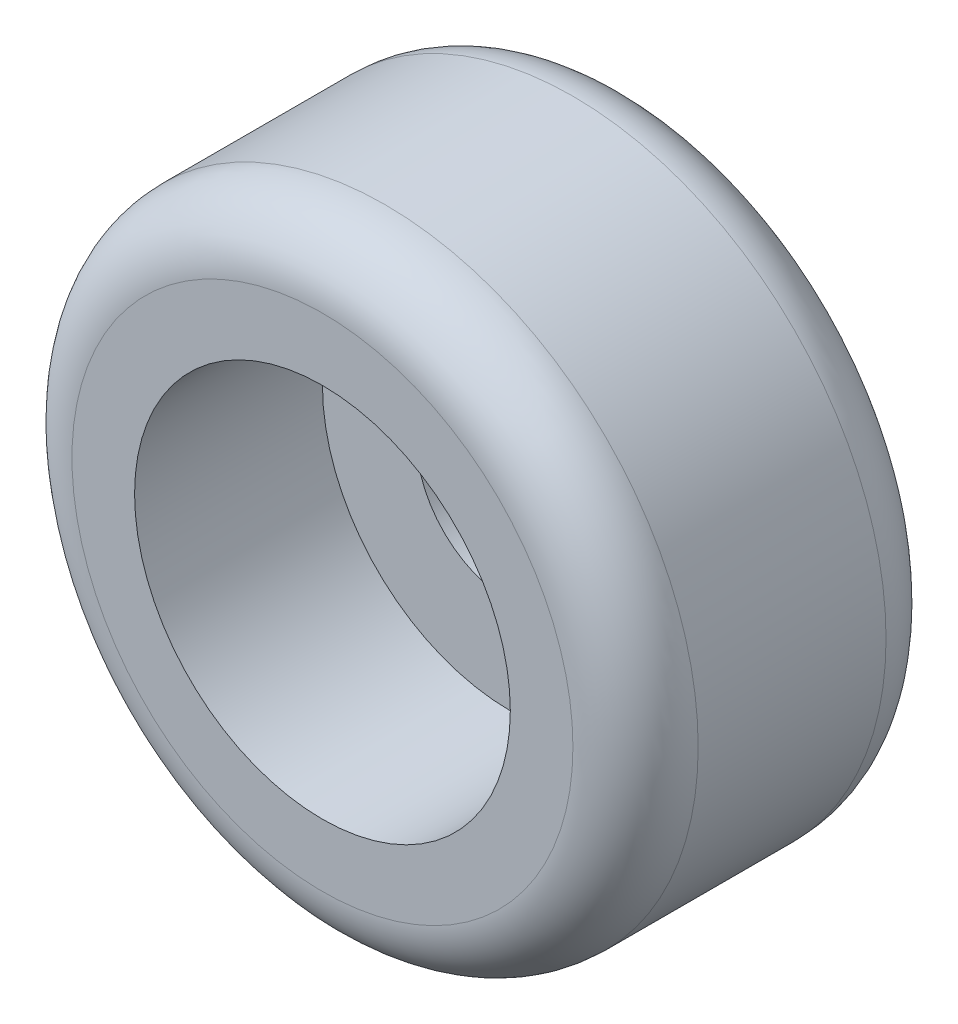
ISO-10303-21;
HEADER;
FILE_DESCRIPTION(('STEP AP214'),'2;1');
FILE_NAME('part.step','',(''),(''),'','','');
FILE_SCHEMA(('AUTOMOTIVE_DESIGN { 1 0 10303 214 1 1 1 1 }'));
ENDSEC;
DATA;
#1=APPLICATION_CONTEXT('core data for automotive mechanical design processes');
#2=APPLICATION_PROTOCOL_DEFINITION('international standard','automotive_design',2000,#1);
#3=PRODUCT_CONTEXT('',#1,'mechanical');
#4=PRODUCT('Part','Part','',(#3));
#5=PRODUCT_RELATED_PRODUCT_CATEGORY('part','',(#4));
#6=PRODUCT_DEFINITION_FORMATION('','',#4);
#7=PRODUCT_DEFINITION_CONTEXT('part definition',#1,'design');
#8=PRODUCT_DEFINITION('design','',#6,#7);
#9=PRODUCT_DEFINITION_SHAPE('','',#8);
#10=(LENGTH_UNIT() NAMED_UNIT(*) SI_UNIT(.MILLI.,.METRE.));
#11=(NAMED_UNIT(*) PLANE_ANGLE_UNIT() SI_UNIT($,.RADIAN.));
#12=(NAMED_UNIT(*) SI_UNIT($,.STERADIAN.) SOLID_ANGLE_UNIT());
#13=UNCERTAINTY_MEASURE_WITH_UNIT(LENGTH_MEASURE(1.E-05),#10,'distance_accuracy_value','');
#14=(GEOMETRIC_REPRESENTATION_CONTEXT(3) GLOBAL_UNCERTAINTY_ASSIGNED_CONTEXT((#13)) GLOBAL_UNIT_ASSIGNED_CONTEXT((#10,
#11,#12)) REPRESENTATION_CONTEXT('',''));
#15=CARTESIAN_POINT('',(0.,0.,0.));
#16=DIRECTION('',(0.,0.,1.));
#17=DIRECTION('',(1.,0.,0.));
#18=AXIS2_PLACEMENT_3D('',#15,#16,#17);
#19=CARTESIAN_POINT('',(0.,0.,5.));
#20=DIRECTION('',(0.,0.,1.));
#21=DIRECTION('',(1.,0.,0.));
#22=AXIS2_PLACEMENT_3D('',#19,#20,#21);
#23=PLANE('',#22);
#24=CARTESIAN_POINT('',(0.,0.,5.));
#25=DIRECTION('',(0.,0.,1.));
#26=DIRECTION('',(1.,0.,0.));
#27=AXIS2_PLACEMENT_3D('',#24,#25,#26);
#28=CIRCLE('',#27,3.);
#29=CARTESIAN_POINT('',(3.,0.,5.));
#30=VERTEX_POINT('',#29);
#31=EDGE_CURVE('E63',#30,#30,#28,.T.);
#32=ORIENTED_EDGE('',*,*,#31,.F.);
#33=EDGE_LOOP('',(#32));
#34=FACE_BOUND('',#33,.T.);
#35=CARTESIAN_POINT('',(0.,0.,5.));
#36=DIRECTION('',(0.,0.,1.));
#37=DIRECTION('',(1.,0.,0.));
#38=AXIS2_PLACEMENT_3D('',#35,#36,#37);
#39=CIRCLE('',#38,4.);
#40=CARTESIAN_POINT('',(4.,0.,5.));
#41=VERTEX_POINT('',#40);
#42=EDGE_CURVE('E75',#41,#41,#39,.T.);
#43=ORIENTED_EDGE('',*,*,#42,.T.);
#44=EDGE_LOOP('',(#43));
#45=FACE_BOUND('',#44,.T.);
#46=ADVANCED_FACE('F44',(#34,#45),#23,.T.);
#47=CARTESIAN_POINT('',(0.,0.,2.));
#48=DIRECTION('',(0.,0.,1.));
#49=DIRECTION('',(1.,0.,0.));
#50=AXIS2_PLACEMENT_3D('',#47,#48,#49);
#51=CYLINDRICAL_SURFACE('',#50,3.);
#52=CARTESIAN_POINT('',(0.,0.,2.));
#53=DIRECTION('',(0.,0.,1.));
#54=DIRECTION('',(1.,0.,0.));
#55=AXIS2_PLACEMENT_3D('',#52,#53,#54);
#56=CIRCLE('',#55,3.);
#57=CARTESIAN_POINT('',(3.,0.,2.));
#58=VERTEX_POINT('',#57);
#59=EDGE_CURVE('E58',#58,#58,#56,.T.);
#60=ORIENTED_EDGE('',*,*,#59,.F.);
#61=EDGE_LOOP('',(#60));
#62=FACE_BOUND('',#61,.T.);
#63=ORIENTED_EDGE('',*,*,#31,.T.);
#64=EDGE_LOOP('',(#63));
#65=FACE_BOUND('',#64,.T.);
#66=ADVANCED_FACE('F96',(#62,#65),#51,.F.);
#67=CARTESIAN_POINT('',(0.,0.,2.));
#68=DIRECTION('',(0.,0.,1.));
#69=DIRECTION('',(1.,0.,0.));
#70=AXIS2_PLACEMENT_3D('',#67,#68,#69);
#71=PLANE('',#70);
#72=CARTESIAN_POINT('',(0.,0.,2.));
#73=DIRECTION('',(0.,0.,1.));
#74=DIRECTION('',(1.,0.,0.));
#75=AXIS2_PLACEMENT_3D('',#72,#73,#74);
#76=CIRCLE('',#75,1.5);
#77=CARTESIAN_POINT('',(1.5,0.,2.));
#78=VERTEX_POINT('',#77);
#79=EDGE_CURVE('E79',#78,#78,#76,.T.);
#80=ORIENTED_EDGE('',*,*,#79,.F.);
#81=EDGE_LOOP('',(#80));
#82=FACE_BOUND('',#81,.T.);
#83=ORIENTED_EDGE('',*,*,#59,.T.);
#84=EDGE_LOOP('',(#83));
#85=FACE_BOUND('',#84,.T.);
#86=ADVANCED_FACE('F92',(#82,#85),#71,.T.);
#87=CARTESIAN_POINT('',(0.,0.,4.));
#88=DIRECTION('',(0.,0.,1.));
#89=DIRECTION('',(1.,0.,0.));
#90=AXIS2_PLACEMENT_3D('',#87,#88,#89);
#91=TOROIDAL_SURFACE('',#90,4.,1.);
#92=CARTESIAN_POINT('',(0.,0.,4.));
#93=DIRECTION('',(0.,0.,1.));
#94=DIRECTION('',(1.,0.,0.));
#95=AXIS2_PLACEMENT_3D('',#92,#93,#94);
#96=CIRCLE('',#95,5.);
#97=CARTESIAN_POINT('',(5.,0.,4.));
#98=VERTEX_POINT('',#97);
#99=EDGE_CURVE('E70',#98,#98,#96,.T.);
#100=ORIENTED_EDGE('',*,*,#99,.T.);
#101=EDGE_LOOP('',(#100));
#102=FACE_BOUND('',#101,.T.);
#103=ORIENTED_EDGE('',*,*,#42,.F.);
#104=EDGE_LOOP('',(#103));
#105=FACE_BOUND('',#104,.T.);
#106=ADVANCED_FACE('F95',(#102,#105),#91,.T.);
#107=CARTESIAN_POINT('',(0.,0.,5.));
#108=DIRECTION('',(0.,0.,-1.));
#109=DIRECTION('',(-1.,0.,0.));
#110=AXIS2_PLACEMENT_3D('',#107,#108,#109);
#111=CYLINDRICAL_SURFACE('',#110,5.);
#112=ORIENTED_EDGE('',*,*,#99,.F.);
#113=EDGE_LOOP('',(#112));
#114=FACE_BOUND('',#113,.T.);
#115=CARTESIAN_POINT('',(0.,0.,1.));
#116=DIRECTION('',(0.,0.,1.));
#117=DIRECTION('',(1.,0.,0.));
#118=AXIS2_PLACEMENT_3D('',#115,#116,#117);
#119=CIRCLE('',#118,5.);
#120=CARTESIAN_POINT('',(5.,0.,1.));
#121=VERTEX_POINT('',#120);
#122=EDGE_CURVE('E74',#121,#121,#119,.T.);
#123=ORIENTED_EDGE('',*,*,#122,.T.);
#124=EDGE_LOOP('',(#123));
#125=FACE_BOUND('',#124,.T.);
#126=ADVANCED_FACE('F111',(#114,#125),#111,.T.);
#127=CARTESIAN_POINT('',(0.,0.,1.));
#128=DIRECTION('',(0.,0.,1.));
#129=DIRECTION('',(1.,0.,0.));
#130=AXIS2_PLACEMENT_3D('',#127,#128,#129);
#131=TOROIDAL_SURFACE('',#130,4.,1.);
#132=ORIENTED_EDGE('',*,*,#122,.F.);
#133=EDGE_LOOP('',(#132));
#134=FACE_BOUND('',#133,.T.);
#135=CARTESIAN_POINT('',(0.,0.,0.));
#136=DIRECTION('',(0.,0.,1.));
#137=DIRECTION('',(1.,0.,0.));
#138=AXIS2_PLACEMENT_3D('',#135,#136,#137);
#139=CIRCLE('',#138,4.);
#140=CARTESIAN_POINT('',(4.,0.,0.));
#141=VERTEX_POINT('',#140);
#142=EDGE_CURVE('E68',#141,#141,#139,.T.);
#143=ORIENTED_EDGE('',*,*,#142,.T.);
#144=EDGE_LOOP('',(#143));
#145=FACE_BOUND('',#144,.T.);
#146=ADVANCED_FACE('F118',(#134,#145),#131,.T.);
#147=CARTESIAN_POINT('',(0.,0.,0.));
#148=DIRECTION('',(0.,0.,1.));
#149=DIRECTION('',(1.,0.,0.));
#150=AXIS2_PLACEMENT_3D('',#147,#148,#149);
#151=PLANE('',#150);
#152=CARTESIAN_POINT('',(0.,0.,0.));
#153=DIRECTION('',(0.,0.,1.));
#154=DIRECTION('',(1.,0.,0.));
#155=AXIS2_PLACEMENT_3D('',#152,#153,#154);
#156=CIRCLE('',#155,2.5);
#157=CARTESIAN_POINT('',(2.5,0.,0.));
#158=VERTEX_POINT('',#157);
#159=EDGE_CURVE('E11',#158,#158,#156,.T.);
#160=ORIENTED_EDGE('',*,*,#159,.T.);
#161=EDGE_LOOP('',(#160));
#162=FACE_BOUND('',#161,.T.);
#163=ORIENTED_EDGE('',*,*,#142,.F.);
#164=EDGE_LOOP('',(#163));
#165=FACE_BOUND('',#164,.T.);
#166=ADVANCED_FACE('F123',(#162,#165),#151,.F.);
#167=CARTESIAN_POINT('',(0.,0.,3.));
#168=DIRECTION('',(0.,0.,-1.));
#169=DIRECTION('',(-1.,0.,0.));
#170=AXIS2_PLACEMENT_3D('',#167,#168,#169);
#171=CYLINDRICAL_SURFACE('',#170,1.5);
#172=CARTESIAN_POINT('',(0.,0.,0.999999999999999));
#173=DIRECTION('',(0.,0.,1.));
#174=DIRECTION('',(1.,0.,0.));
#175=AXIS2_PLACEMENT_3D('',#172,#173,#174);
#176=CIRCLE('',#175,1.5);
#177=CARTESIAN_POINT('',(1.5,0.,0.999999999999999));
#178=VERTEX_POINT('',#177);
#179=EDGE_CURVE('E53',#178,#178,#176,.F.);
#180=ORIENTED_EDGE('',*,*,#179,.T.);
#181=EDGE_LOOP('',(#180));
#182=FACE_BOUND('',#181,.T.);
#183=ORIENTED_EDGE('',*,*,#79,.T.);
#184=EDGE_LOOP('',(#183));
#185=FACE_BOUND('',#184,.T.);
#186=ADVANCED_FACE('F90',(#182,#185),#171,.F.);
#187=CARTESIAN_POINT('',(0.,0.,0.999999999999999));
#188=DIRECTION('',(0.,0.,-1.));
#189=DIRECTION('',(-1.,0.,0.));
#190=AXIS2_PLACEMENT_3D('',#187,#188,#189);
#191=CONICAL_SURFACE('',#190,1.5,0.78539816339745);
#192=ORIENTED_EDGE('',*,*,#159,.F.);
#193=EDGE_LOOP('',(#192));
#194=FACE_BOUND('',#193,.T.);
#195=ORIENTED_EDGE('',*,*,#179,.F.);
#196=EDGE_LOOP('',(#195));
#197=FACE_BOUND('',#196,.T.);
#198=ADVANCED_FACE('F47',(#194,#197),#191,.F.);
#199=CLOSED_SHELL('',(#46,#66,#86,#106,#126,#146,#166,#186,#198));
#200=MANIFOLD_SOLID_BREP('B2',#199);
#201=ADVANCED_BREP_SHAPE_REPRESENTATION('',(#18,#200),#14);
#202=SHAPE_DEFINITION_REPRESENTATION(#9,#201);
ENDSEC;
END-ISO-10303-21;
